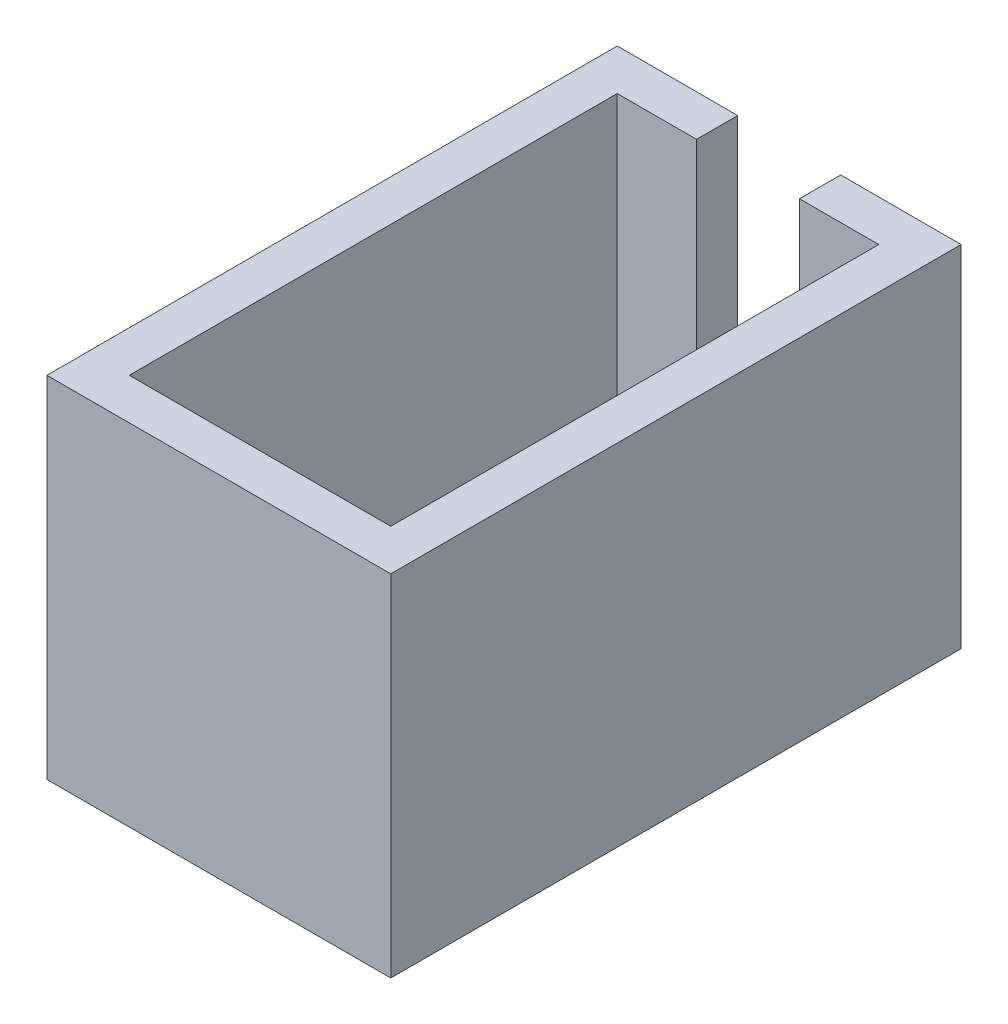
ISO-10303-21;
HEADER;
FILE_DESCRIPTION(('STEP AP214'),'2;1');
FILE_NAME('part.step','',(''),(''),'','','');
FILE_SCHEMA(('AUTOMOTIVE_DESIGN { 1 0 10303 214 1 1 1 1 }'));
ENDSEC;
DATA;
#1=APPLICATION_CONTEXT('core data for automotive mechanical design processes');
#2=APPLICATION_PROTOCOL_DEFINITION('international standard','automotive_design',2000,#1);
#3=PRODUCT_CONTEXT('',#1,'mechanical');
#4=PRODUCT('Part','Part','',(#3));
#5=PRODUCT_RELATED_PRODUCT_CATEGORY('part','',(#4));
#6=PRODUCT_DEFINITION_FORMATION('','',#4);
#7=PRODUCT_DEFINITION_CONTEXT('part definition',#1,'design');
#8=PRODUCT_DEFINITION('design','',#6,#7);
#9=PRODUCT_DEFINITION_SHAPE('','',#8);
#10=(LENGTH_UNIT() NAMED_UNIT(*) SI_UNIT(.MILLI.,.METRE.));
#11=(NAMED_UNIT(*) PLANE_ANGLE_UNIT() SI_UNIT($,.RADIAN.));
#12=(NAMED_UNIT(*) SI_UNIT($,.STERADIAN.) SOLID_ANGLE_UNIT());
#13=UNCERTAINTY_MEASURE_WITH_UNIT(LENGTH_MEASURE(1.E-05),#10,'distance_accuracy_value','');
#14=(GEOMETRIC_REPRESENTATION_CONTEXT(3) GLOBAL_UNCERTAINTY_ASSIGNED_CONTEXT((#13)) GLOBAL_UNIT_ASSIGNED_CONTEXT((#10,
#11,#12)) REPRESENTATION_CONTEXT('',''));
#15=CARTESIAN_POINT('',(0.,0.,0.));
#16=DIRECTION('',(0.,0.,1.));
#17=DIRECTION('',(1.,0.,0.));
#18=AXIS2_PLACEMENT_3D('',#15,#16,#17);
#19=CARTESIAN_POINT('',(0.,2.,0.));
#20=DIRECTION('',(0.,-1.,0.));
#21=DIRECTION('',(0.,0.,-1.));
#22=AXIS2_PLACEMENT_3D('',#19,#20,#21);
#23=PLANE('',#22);
#24=DIRECTION('',(0.,0.,1.));
#25=VECTOR('',#24,1.);
#26=CARTESIAN_POINT('',(0.,2.,0.));
#27=LINE('',#26,#25);
#28=CARTESIAN_POINT('',(0.,2.,-23.7));
#29=VERTEX_POINT('',#28);
#30=CARTESIAN_POINT('',(0.,2.,0.));
#31=VERTEX_POINT('',#30);
#32=EDGE_CURVE('E216',#29,#31,#27,.T.);
#33=ORIENTED_EDGE('',*,*,#32,.T.);
#34=DIRECTION('',(1.,0.,0.));
#35=VECTOR('',#34,1.);
#36=CARTESIAN_POINT('',(0.,2.,0.));
#37=LINE('',#36,#35);
#38=CARTESIAN_POINT('',(12.7,2.,0.));
#39=VERTEX_POINT('',#38);
#40=EDGE_CURVE('E230',#31,#39,#37,.T.);
#41=ORIENTED_EDGE('',*,*,#40,.T.);
#42=DIRECTION('',(0.,0.,-1.));
#43=VECTOR('',#42,1.);
#44=CARTESIAN_POINT('',(12.7,2.,0.));
#45=LINE('',#44,#43);
#46=CARTESIAN_POINT('',(12.7,2.,-23.7));
#47=VERTEX_POINT('',#46);
#48=EDGE_CURVE('E46',#39,#47,#45,.T.);
#49=ORIENTED_EDGE('',*,*,#48,.T.);
#50=DIRECTION('',(-1.,0.,0.));
#51=VECTOR('',#50,1.);
#52=CARTESIAN_POINT('',(0.,2.,-23.7));
#53=LINE('',#52,#51);
#54=EDGE_CURVE('E11',#47,#29,#53,.T.);
#55=ORIENTED_EDGE('',*,*,#54,.T.);
#56=EDGE_LOOP('',(#33,#41,#49,#55));
#57=FACE_BOUND('',#56,.T.);
#58=ADVANCED_FACE('F37',(#57),#23,.F.);
#59=CARTESIAN_POINT('',(0.,0.,0.));
#60=DIRECTION('',(0.,-1.,0.));
#61=DIRECTION('',(0.,0.,-1.));
#62=AXIS2_PLACEMENT_3D('',#59,#60,#61);
#63=PLANE('',#62);
#64=DIRECTION('',(1.,0.,0.));
#65=VECTOR('',#64,1.);
#66=CARTESIAN_POINT('',(0.,0.,2.));
#67=LINE('',#66,#65);
#68=CARTESIAN_POINT('',(-2.,0.,2.));
#69=VERTEX_POINT('',#68);
#70=CARTESIAN_POINT('',(14.7,0.,2.));
#71=VERTEX_POINT('',#70);
#72=EDGE_CURVE('E211',#69,#71,#67,.T.);
#73=ORIENTED_EDGE('',*,*,#72,.F.);
#74=DIRECTION('',(0.,0.,1.));
#75=VECTOR('',#74,1.);
#76=CARTESIAN_POINT('',(-2.,0.,-25.7));
#77=LINE('',#76,#75);
#78=CARTESIAN_POINT('',(-2.,0.,-25.7));
#79=VERTEX_POINT('',#78);
#80=EDGE_CURVE('E166',#79,#69,#77,.T.);
#81=ORIENTED_EDGE('',*,*,#80,.F.);
#82=DIRECTION('',(-1.,0.,0.));
#83=VECTOR('',#82,1.);
#84=CARTESIAN_POINT('',(12.7,0.,-25.7));
#85=LINE('',#84,#83);
#86=CARTESIAN_POINT('',(14.7,0.,-25.7));
#87=VERTEX_POINT('',#86);
#88=EDGE_CURVE('E197',#87,#79,#85,.T.);
#89=ORIENTED_EDGE('',*,*,#88,.F.);
#90=DIRECTION('',(0.,0.,-1.));
#91=VECTOR('',#90,1.);
#92=CARTESIAN_POINT('',(14.7,0.,2.));
#93=LINE('',#92,#91);
#94=EDGE_CURVE('E183',#71,#87,#93,.T.);
#95=ORIENTED_EDGE('',*,*,#94,.F.);
#96=EDGE_LOOP('',(#73,#81,#89,#95));
#97=FACE_BOUND('',#96,.T.);
#98=ADVANCED_FACE('F39',(#97),#63,.T.);
#99=CARTESIAN_POINT('',(0.,0.,0.));
#100=DIRECTION('',(0.,0.,-1.));
#101=DIRECTION('',(-1.,0.,0.));
#102=AXIS2_PLACEMENT_3D('',#99,#100,#101);
#103=PLANE('',#102);
#104=ORIENTED_EDGE('',*,*,#40,.F.);
#105=DIRECTION('',(0.,-1.,0.));
#106=VECTOR('',#105,1.);
#107=CARTESIAN_POINT('',(0.,0.,0.));
#108=LINE('',#107,#106);
#109=CARTESIAN_POINT('',(0.,17.,0.));
#110=VERTEX_POINT('',#109);
#111=EDGE_CURVE('E202',#110,#31,#108,.T.);
#112=ORIENTED_EDGE('',*,*,#111,.F.);
#113=DIRECTION('',(-1.,0.,0.));
#114=VECTOR('',#113,1.);
#115=CARTESIAN_POINT('',(0.,17.,0.));
#116=LINE('',#115,#114);
#117=CARTESIAN_POINT('',(12.7,17.,0.));
#118=VERTEX_POINT('',#117);
#119=EDGE_CURVE('E214',#118,#110,#116,.T.);
#120=ORIENTED_EDGE('',*,*,#119,.F.);
#121=DIRECTION('',(0.,1.,0.));
#122=VECTOR('',#121,1.);
#123=CARTESIAN_POINT('',(12.7,0.,0.));
#124=LINE('',#123,#122);
#125=EDGE_CURVE('E223',#39,#118,#124,.T.);
#126=ORIENTED_EDGE('',*,*,#125,.F.);
#127=EDGE_LOOP('',(#104,#112,#120,#126));
#128=FACE_BOUND('',#127,.T.);
#129=ADVANCED_FACE('F259',(#128),#103,.T.);
#130=CARTESIAN_POINT('',(0.,17.,2.));
#131=DIRECTION('',(0.,-1.,0.));
#132=DIRECTION('',(0.,0.,-1.));
#133=AXIS2_PLACEMENT_3D('',#130,#131,#132);
#134=PLANE('',#133);
#135=DIRECTION('',(1.,0.,0.));
#136=VECTOR('',#135,1.);
#137=CARTESIAN_POINT('',(12.7,17.,-23.7));
#138=LINE('',#137,#136);
#139=CARTESIAN_POINT('',(0.,17.,-23.7));
#140=VERTEX_POINT('',#139);
#141=CARTESIAN_POINT('',(3.85,17.,-23.7));
#142=VERTEX_POINT('',#141);
#143=EDGE_CURVE('E200',#140,#142,#138,.T.);
#144=ORIENTED_EDGE('',*,*,#143,.T.);
#145=DIRECTION('',(0.,0.,1.));
#146=VECTOR('',#145,1.);
#147=CARTESIAN_POINT('',(3.85,17.,-25.701));
#148=LINE('',#147,#146);
#149=CARTESIAN_POINT('',(3.85,17.,-25.7));
#150=VERTEX_POINT('',#149);
#151=EDGE_CURVE('E145',#150,#142,#148,.T.);
#152=ORIENTED_EDGE('',*,*,#151,.F.);
#153=DIRECTION('',(1.,0.,0.));
#154=VECTOR('',#153,1.);
#155=CARTESIAN_POINT('',(12.7,17.,-25.7));
#156=LINE('',#155,#154);
#157=CARTESIAN_POINT('',(-2.,17.,-25.7));
#158=VERTEX_POINT('',#157);
#159=EDGE_CURVE('E150',#158,#150,#156,.T.);
#160=ORIENTED_EDGE('',*,*,#159,.F.);
#161=DIRECTION('',(0.,0.,-1.));
#162=VECTOR('',#161,1.);
#163=CARTESIAN_POINT('',(-2.,17.,-25.7));
#164=LINE('',#163,#162);
#165=CARTESIAN_POINT('',(-2.,17.,2.));
#166=VERTEX_POINT('',#165);
#167=EDGE_CURVE('E172',#166,#158,#164,.T.);
#168=ORIENTED_EDGE('',*,*,#167,.F.);
#169=DIRECTION('',(-1.,0.,0.));
#170=VECTOR('',#169,1.);
#171=CARTESIAN_POINT('',(0.,17.,2.));
#172=LINE('',#171,#170);
#173=CARTESIAN_POINT('',(14.7,17.,2.));
#174=VERTEX_POINT('',#173);
#175=EDGE_CURVE('E213',#174,#166,#172,.T.);
#176=ORIENTED_EDGE('',*,*,#175,.F.);
#177=DIRECTION('',(0.,0.,1.));
#178=VECTOR('',#177,1.);
#179=CARTESIAN_POINT('',(14.7,17.,2.));
#180=LINE('',#179,#178);
#181=CARTESIAN_POINT('',(14.7,17.,-25.7));
#182=VERTEX_POINT('',#181);
#183=EDGE_CURVE('E189',#182,#174,#180,.T.);
#184=ORIENTED_EDGE('',*,*,#183,.F.);
#185=CARTESIAN_POINT('',(8.85,17.,-25.7));
#186=VERTEX_POINT('',#185);
#187=EDGE_CURVE('E199',#186,#182,#156,.T.);
#188=ORIENTED_EDGE('',*,*,#187,.F.);
#189=DIRECTION('',(0.,0.,1.));
#190=VECTOR('',#189,1.);
#191=CARTESIAN_POINT('',(8.85,17.,-25.701));
#192=LINE('',#191,#190);
#193=CARTESIAN_POINT('',(8.85,17.,-23.7));
#194=VERTEX_POINT('',#193);
#195=EDGE_CURVE('E159',#186,#194,#192,.T.);
#196=ORIENTED_EDGE('',*,*,#195,.T.);
#197=CARTESIAN_POINT('',(12.7,17.,-23.7));
#198=VERTEX_POINT('',#197);
#199=EDGE_CURVE('E41',#194,#198,#138,.T.);
#200=ORIENTED_EDGE('',*,*,#199,.T.);
#201=DIRECTION('',(0.,0.,1.));
#202=VECTOR('',#201,1.);
#203=CARTESIAN_POINT('',(12.7,17.,2.));
#204=LINE('',#203,#202);
#205=EDGE_CURVE('E175',#198,#118,#204,.T.);
#206=ORIENTED_EDGE('',*,*,#205,.T.);
#207=ORIENTED_EDGE('',*,*,#119,.T.);
#208=DIRECTION('',(0.,0.,-1.));
#209=VECTOR('',#208,1.);
#210=CARTESIAN_POINT('',(0.,17.,-25.7));
#211=LINE('',#210,#209);
#212=EDGE_CURVE('E144',#110,#140,#211,.T.);
#213=ORIENTED_EDGE('',*,*,#212,.T.);
#214=EDGE_LOOP('',(#144,#152,#160,#168,#176,#184,#188,#196,#200,#206,#207,#213));
#215=FACE_BOUND('',#214,.T.);
#216=ADVANCED_FACE('F250',(#215),#134,.F.);
#217=CARTESIAN_POINT('',(0.,0.,2.));
#218=DIRECTION('',(0.,0.,-1.));
#219=DIRECTION('',(-1.,0.,0.));
#220=AXIS2_PLACEMENT_3D('',#217,#218,#219);
#221=PLANE('',#220);
#222=ORIENTED_EDGE('',*,*,#175,.T.);
#223=DIRECTION('',(0.,1.,0.));
#224=VECTOR('',#223,1.);
#225=CARTESIAN_POINT('',(-2.,0.,2.));
#226=LINE('',#225,#224);
#227=EDGE_CURVE('E169',#69,#166,#226,.T.);
#228=ORIENTED_EDGE('',*,*,#227,.F.);
#229=ORIENTED_EDGE('',*,*,#72,.T.);
#230=DIRECTION('',(0.,-1.,0.));
#231=VECTOR('',#230,1.);
#232=CARTESIAN_POINT('',(14.7,0.,2.));
#233=LINE('',#232,#231);
#234=EDGE_CURVE('E180',#174,#71,#233,.T.);
#235=ORIENTED_EDGE('',*,*,#234,.F.);
#236=EDGE_LOOP('',(#222,#228,#229,#235));
#237=FACE_BOUND('',#236,.T.);
#238=ADVANCED_FACE('F286',(#237),#221,.F.);
#239=CARTESIAN_POINT('',(0.,0.,-23.7));
#240=DIRECTION('',(0.,0.,1.));
#241=DIRECTION('',(1.,0.,0.));
#242=AXIS2_PLACEMENT_3D('',#239,#240,#241);
#243=PLANE('',#242);
#244=DIRECTION('',(0.,-1.,0.));
#245=VECTOR('',#244,1.);
#246=CARTESIAN_POINT('',(3.85,17.,-23.7));
#247=LINE('',#246,#245);
#248=CARTESIAN_POINT('',(3.85,4.5,-23.7));
#249=VERTEX_POINT('',#248);
#250=EDGE_CURVE('E133',#142,#249,#247,.T.);
#251=ORIENTED_EDGE('',*,*,#250,.F.);
#252=ORIENTED_EDGE('',*,*,#143,.F.);
#253=DIRECTION('',(0.,1.,0.));
#254=VECTOR('',#253,1.);
#255=CARTESIAN_POINT('',(0.,0.,-23.7));
#256=LINE('',#255,#254);
#257=EDGE_CURVE('E62',#29,#140,#256,.T.);
#258=ORIENTED_EDGE('',*,*,#257,.F.);
#259=ORIENTED_EDGE('',*,*,#54,.F.);
#260=DIRECTION('',(0.,-1.,0.));
#261=VECTOR('',#260,1.);
#262=CARTESIAN_POINT('',(12.7,0.,-23.7));
#263=LINE('',#262,#261);
#264=EDGE_CURVE('E192',#198,#47,#263,.T.);
#265=ORIENTED_EDGE('',*,*,#264,.F.);
#266=ORIENTED_EDGE('',*,*,#199,.F.);
#267=DIRECTION('',(0.,1.,0.));
#268=VECTOR('',#267,1.);
#269=CARTESIAN_POINT('',(8.85,17.,-23.7));
#270=LINE('',#269,#268);
#271=CARTESIAN_POINT('',(8.85,4.5,-23.7));
#272=VERTEX_POINT('',#271);
#273=EDGE_CURVE('E138',#272,#194,#270,.T.);
#274=ORIENTED_EDGE('',*,*,#273,.F.);
#275=DIRECTION('',(1.,0.,0.));
#276=VECTOR('',#275,1.);
#277=CARTESIAN_POINT('',(3.85,4.5,-23.7));
#278=LINE('',#277,#276);
#279=EDGE_CURVE('E152',#249,#272,#278,.T.);
#280=ORIENTED_EDGE('',*,*,#279,.F.);
#281=EDGE_LOOP('',(#251,#252,#258,#259,#265,#266,#274,#280));
#282=FACE_BOUND('',#281,.T.);
#283=ADVANCED_FACE('F254',(#282),#243,.T.);
#284=CARTESIAN_POINT('',(0.,0.,-25.7));
#285=DIRECTION('',(0.,0.,1.));
#286=DIRECTION('',(1.,0.,0.));
#287=AXIS2_PLACEMENT_3D('',#284,#285,#286);
#288=PLANE('',#287);
#289=ORIENTED_EDGE('',*,*,#159,.T.);
#290=DIRECTION('',(0.,1.,0.));
#291=VECTOR('',#290,1.);
#292=CARTESIAN_POINT('',(3.85,17.,-25.7));
#293=LINE('',#292,#291);
#294=CARTESIAN_POINT('',(3.85,4.5,-25.7));
#295=VERTEX_POINT('',#294);
#296=EDGE_CURVE('E130',#295,#150,#293,.T.);
#297=ORIENTED_EDGE('',*,*,#296,.F.);
#298=DIRECTION('',(-1.,0.,0.));
#299=VECTOR('',#298,1.);
#300=CARTESIAN_POINT('',(3.85,4.5,-25.7));
#301=LINE('',#300,#299);
#302=CARTESIAN_POINT('',(8.85,4.5,-25.7));
#303=VERTEX_POINT('',#302);
#304=EDGE_CURVE('E141',#303,#295,#301,.T.);
#305=ORIENTED_EDGE('',*,*,#304,.F.);
#306=DIRECTION('',(0.,-1.,0.));
#307=VECTOR('',#306,1.);
#308=CARTESIAN_POINT('',(8.85,17.,-25.7));
#309=LINE('',#308,#307);
#310=EDGE_CURVE('E54',#186,#303,#309,.T.);
#311=ORIENTED_EDGE('',*,*,#310,.F.);
#312=ORIENTED_EDGE('',*,*,#187,.T.);
#313=DIRECTION('',(0.,1.,0.));
#314=VECTOR('',#313,1.);
#315=CARTESIAN_POINT('',(14.7,0.,-25.7));
#316=LINE('',#315,#314);
#317=EDGE_CURVE('E186',#87,#182,#316,.T.);
#318=ORIENTED_EDGE('',*,*,#317,.F.);
#319=ORIENTED_EDGE('',*,*,#88,.T.);
#320=DIRECTION('',(0.,-1.,0.));
#321=VECTOR('',#320,1.);
#322=CARTESIAN_POINT('',(-2.,0.,-25.7));
#323=LINE('',#322,#321);
#324=EDGE_CURVE('E163',#158,#79,#323,.T.);
#325=ORIENTED_EDGE('',*,*,#324,.F.);
#326=EDGE_LOOP('',(#289,#297,#305,#311,#312,#318,#319,#325));
#327=FACE_BOUND('',#326,.T.);
#328=ADVANCED_FACE('F148',(#327),#288,.F.);
#329=CARTESIAN_POINT('',(14.7,0.,0.));
#330=DIRECTION('',(-1.,0.,0.));
#331=DIRECTION('',(0.,0.,1.));
#332=AXIS2_PLACEMENT_3D('',#329,#330,#331);
#333=PLANE('',#332);
#334=ORIENTED_EDGE('',*,*,#234,.T.);
#335=ORIENTED_EDGE('',*,*,#94,.T.);
#336=ORIENTED_EDGE('',*,*,#317,.T.);
#337=ORIENTED_EDGE('',*,*,#183,.T.);
#338=EDGE_LOOP('',(#334,#335,#336,#337));
#339=FACE_BOUND('',#338,.T.);
#340=ADVANCED_FACE('F296',(#339),#333,.F.);
#341=CARTESIAN_POINT('',(12.7,0.,0.));
#342=DIRECTION('',(-1.,0.,0.));
#343=DIRECTION('',(0.,0.,1.));
#344=AXIS2_PLACEMENT_3D('',#341,#342,#343);
#345=PLANE('',#344);
#346=ORIENTED_EDGE('',*,*,#205,.F.);
#347=ORIENTED_EDGE('',*,*,#264,.T.);
#348=ORIENTED_EDGE('',*,*,#48,.F.);
#349=ORIENTED_EDGE('',*,*,#125,.T.);
#350=EDGE_LOOP('',(#346,#347,#348,#349));
#351=FACE_BOUND('',#350,.T.);
#352=ADVANCED_FACE('F257',(#351),#345,.T.);
#353=CARTESIAN_POINT('',(-2.,0.,0.));
#354=DIRECTION('',(1.,0.,0.));
#355=DIRECTION('',(0.,0.,-1.));
#356=AXIS2_PLACEMENT_3D('',#353,#354,#355);
#357=PLANE('',#356);
#358=ORIENTED_EDGE('',*,*,#324,.T.);
#359=ORIENTED_EDGE('',*,*,#80,.T.);
#360=ORIENTED_EDGE('',*,*,#227,.T.);
#361=ORIENTED_EDGE('',*,*,#167,.T.);
#362=EDGE_LOOP('',(#358,#359,#360,#361));
#363=FACE_BOUND('',#362,.T.);
#364=ADVANCED_FACE('F267',(#363),#357,.F.);
#365=CARTESIAN_POINT('',(0.,0.,0.));
#366=DIRECTION('',(1.,0.,0.));
#367=DIRECTION('',(0.,0.,-1.));
#368=AXIS2_PLACEMENT_3D('',#365,#366,#367);
#369=PLANE('',#368);
#370=ORIENTED_EDGE('',*,*,#212,.F.);
#371=ORIENTED_EDGE('',*,*,#111,.T.);
#372=ORIENTED_EDGE('',*,*,#32,.F.);
#373=ORIENTED_EDGE('',*,*,#257,.T.);
#374=EDGE_LOOP('',(#370,#371,#372,#373));
#375=FACE_BOUND('',#374,.T.);
#376=ADVANCED_FACE('F265',(#375),#369,.T.);
#377=CARTESIAN_POINT('',(3.85,17.,-25.701));
#378=DIRECTION('',(-1.,0.,0.));
#379=DIRECTION('',(0.,-1.,0.));
#380=AXIS2_PLACEMENT_3D('',#377,#378,#379);
#381=PLANE('',#380);
#382=ORIENTED_EDGE('',*,*,#296,.T.);
#383=ORIENTED_EDGE('',*,*,#151,.T.);
#384=ORIENTED_EDGE('',*,*,#250,.T.);
#385=DIRECTION('',(0.,0.,1.));
#386=VECTOR('',#385,1.);
#387=CARTESIAN_POINT('',(3.85,4.5,-25.701));
#388=LINE('',#387,#386);
#389=EDGE_CURVE('E126',#295,#249,#388,.T.);
#390=ORIENTED_EDGE('',*,*,#389,.F.);
#391=EDGE_LOOP('',(#382,#383,#384,#390));
#392=FACE_BOUND('',#391,.T.);
#393=ADVANCED_FACE('F128',(#392),#381,.F.);
#394=CARTESIAN_POINT('',(8.85,17.,-25.701));
#395=DIRECTION('',(1.,0.,0.));
#396=DIRECTION('',(0.,1.,0.));
#397=AXIS2_PLACEMENT_3D('',#394,#395,#396);
#398=PLANE('',#397);
#399=ORIENTED_EDGE('',*,*,#310,.T.);
#400=DIRECTION('',(0.,0.,1.));
#401=VECTOR('',#400,1.);
#402=CARTESIAN_POINT('',(8.85,4.5,-25.701));
#403=LINE('',#402,#401);
#404=EDGE_CURVE('E137',#303,#272,#403,.T.);
#405=ORIENTED_EDGE('',*,*,#404,.T.);
#406=ORIENTED_EDGE('',*,*,#273,.T.);
#407=ORIENTED_EDGE('',*,*,#195,.F.);
#408=EDGE_LOOP('',(#399,#405,#406,#407));
#409=FACE_BOUND('',#408,.T.);
#410=ADVANCED_FACE('F273',(#409),#398,.F.);
#411=CARTESIAN_POINT('',(3.85,4.5,-25.701));
#412=DIRECTION('',(0.,-1.,0.));
#413=DIRECTION('',(1.,0.,0.));
#414=AXIS2_PLACEMENT_3D('',#411,#412,#413);
#415=PLANE('',#414);
#416=ORIENTED_EDGE('',*,*,#304,.T.);
#417=ORIENTED_EDGE('',*,*,#389,.T.);
#418=ORIENTED_EDGE('',*,*,#279,.T.);
#419=ORIENTED_EDGE('',*,*,#404,.F.);
#420=EDGE_LOOP('',(#416,#417,#418,#419));
#421=FACE_BOUND('',#420,.T.);
#422=ADVANCED_FACE('F142',(#421),#415,.F.);
#423=CLOSED_SHELL('',(#58,#98,#129,#216,#238,#283,#328,#340,#352,#364,#376,#393,#410,#422));
#424=MANIFOLD_SOLID_BREP('B2',#423);
#425=ADVANCED_BREP_SHAPE_REPRESENTATION('',(#18,#424),#14);
#426=SHAPE_DEFINITION_REPRESENTATION(#9,#425);
ENDSEC;
END-ISO-10303-21;
